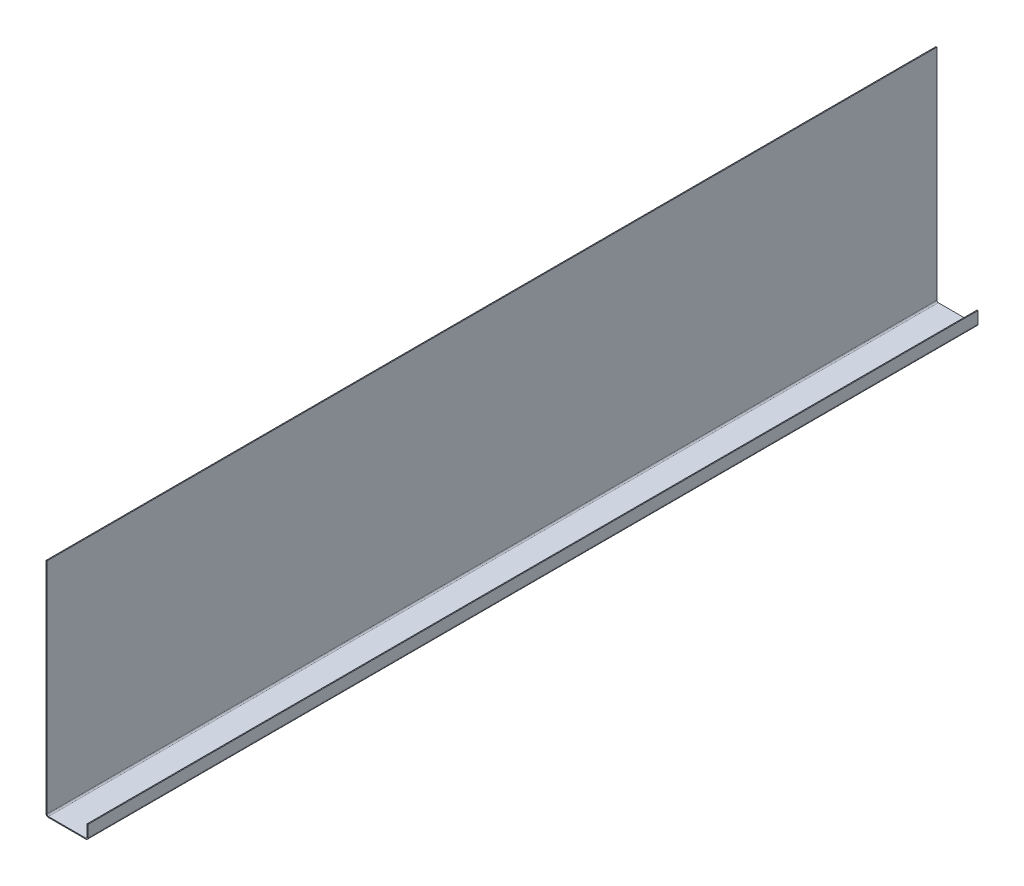
ISO-10303-21;
HEADER;
FILE_DESCRIPTION(('STEP AP214'),'2;1');
FILE_NAME('part.step','',(''),(''),'','','');
FILE_SCHEMA(('AUTOMOTIVE_DESIGN { 1 0 10303 214 1 1 1 1 }'));
ENDSEC;
DATA;
#1=APPLICATION_CONTEXT('core data for automotive mechanical design processes');
#2=APPLICATION_PROTOCOL_DEFINITION('international standard','automotive_design',2000,#1);
#3=PRODUCT_CONTEXT('',#1,'mechanical');
#4=PRODUCT('Part','Part','',(#3));
#5=PRODUCT_RELATED_PRODUCT_CATEGORY('part','',(#4));
#6=PRODUCT_DEFINITION_FORMATION('','',#4);
#7=PRODUCT_DEFINITION_CONTEXT('part definition',#1,'design');
#8=PRODUCT_DEFINITION('design','',#6,#7);
#9=PRODUCT_DEFINITION_SHAPE('','',#8);
#10=(LENGTH_UNIT() NAMED_UNIT(*) SI_UNIT(.MILLI.,.METRE.));
#11=(NAMED_UNIT(*) PLANE_ANGLE_UNIT() SI_UNIT($,.RADIAN.));
#12=(NAMED_UNIT(*) SI_UNIT($,.STERADIAN.) SOLID_ANGLE_UNIT());
#13=UNCERTAINTY_MEASURE_WITH_UNIT(LENGTH_MEASURE(1.E-05),#10,'distance_accuracy_value','');
#14=(GEOMETRIC_REPRESENTATION_CONTEXT(3) GLOBAL_UNCERTAINTY_ASSIGNED_CONTEXT((#13)) GLOBAL_UNIT_ASSIGNED_CONTEXT((#10,
#11,#12)) REPRESENTATION_CONTEXT('',''));
#15=CARTESIAN_POINT('',(0.,0.,0.));
#16=DIRECTION('',(0.,0.,1.));
#17=DIRECTION('',(1.,0.,0.));
#18=AXIS2_PLACEMENT_3D('',#15,#16,#17);
#19=CARTESIAN_POINT('',(0.,3.24999999999998,1205.));
#20=DIRECTION('',(0.,0.,1.));
#21=DIRECTION('',(1.,0.,0.));
#22=AXIS2_PLACEMENT_3D('',#19,#20,#21);
#23=PLANE('',#22);
#24=DIRECTION('',(1.,0.,0.));
#25=VECTOR('',#24,1.);
#26=CARTESIAN_POINT('',(0.,3.24999999999998,1205.));
#27=LINE('',#26,#25);
#28=CARTESIAN_POINT('',(0.,3.24999999999998,1205.));
#29=VERTEX_POINT('',#28);
#30=CARTESIAN_POINT('',(1.25,3.24999999999998,1205.));
#31=VERTEX_POINT('',#30);
#32=EDGE_CURVE('E11',#29,#31,#27,.T.);
#33=ORIENTED_EDGE('',*,*,#32,.F.);
#34=CARTESIAN_POINT('',(3.25,3.24999999999999,1205.));
#35=DIRECTION('',(0.,0.,-1.));
#36=DIRECTION('',(-1.,0.,0.));
#37=AXIS2_PLACEMENT_3D('',#34,#35,#36);
#38=CIRCLE('',#37,3.25);
#39=CARTESIAN_POINT('',(3.25,0.,1205.));
#40=VERTEX_POINT('',#39);
#41=EDGE_CURVE('E146',#29,#40,#38,.F.);
#42=ORIENTED_EDGE('',*,*,#41,.T.);
#43=DIRECTION('',(0.,-1.,0.));
#44=VECTOR('',#43,1.);
#45=CARTESIAN_POINT('',(3.25,1.25,1205.));
#46=LINE('',#45,#44);
#47=CARTESIAN_POINT('',(3.25,1.25,1205.));
#48=VERTEX_POINT('',#47);
#49=EDGE_CURVE('E44',#48,#40,#46,.T.);
#50=ORIENTED_EDGE('',*,*,#49,.F.);
#51=CARTESIAN_POINT('',(3.25,3.24999999999999,1205.));
#52=DIRECTION('',(0.,0.,1.));
#53=DIRECTION('',(1.,0.,0.));
#54=AXIS2_PLACEMENT_3D('',#51,#52,#53);
#55=CIRCLE('',#54,2.);
#56=EDGE_CURVE('E240',#31,#48,#55,.T.);
#57=ORIENTED_EDGE('',*,*,#56,.F.);
#58=EDGE_LOOP('',(#33,#42,#50,#57));
#59=FACE_BOUND('',#58,.T.);
#60=ADVANCED_FACE('F36',(#59),#23,.T.);
#61=CARTESIAN_POINT('',(3.25,1.25,1205.));
#62=DIRECTION('',(0.,0.,1.));
#63=DIRECTION('',(1.,0.,0.));
#64=AXIS2_PLACEMENT_3D('',#61,#62,#63);
#65=PLANE('',#64);
#66=DIRECTION('',(0.,-1.,0.));
#67=VECTOR('',#66,1.);
#68=CARTESIAN_POINT('',(0.,300.,1205.));
#69=LINE('',#68,#67);
#70=CARTESIAN_POINT('',(0.,300.,1205.));
#71=VERTEX_POINT('',#70);
#72=EDGE_CURVE('E151',#71,#29,#69,.T.);
#73=ORIENTED_EDGE('',*,*,#72,.T.);
#74=ORIENTED_EDGE('',*,*,#32,.T.);
#75=DIRECTION('',(0.,1.,0.));
#76=VECTOR('',#75,1.);
#77=CARTESIAN_POINT('',(1.25,300.,1205.));
#78=LINE('',#77,#76);
#79=CARTESIAN_POINT('',(1.25,300.,1205.));
#80=VERTEX_POINT('',#79);
#81=EDGE_CURVE('E253',#80,#31,#78,.F.);
#82=ORIENTED_EDGE('',*,*,#81,.F.);
#83=DIRECTION('',(1.,0.,0.));
#84=VECTOR('',#83,1.);
#85=CARTESIAN_POINT('',(0.,300.,1205.));
#86=LINE('',#85,#84);
#87=EDGE_CURVE('E255',#71,#80,#86,.T.);
#88=ORIENTED_EDGE('',*,*,#87,.F.);
#89=EDGE_LOOP('',(#73,#74,#82,#88));
#90=FACE_BOUND('',#89,.T.);
#91=ADVANCED_FACE('F266',(#90),#65,.T.);
#92=CARTESIAN_POINT('',(3.25,0.,0.));
#93=DIRECTION('',(0.,0.,-1.));
#94=DIRECTION('',(-1.,0.,0.));
#95=AXIS2_PLACEMENT_3D('',#92,#93,#94);
#96=PLANE('',#95);
#97=DIRECTION('',(0.,1.,0.));
#98=VECTOR('',#97,1.);
#99=CARTESIAN_POINT('',(3.25,0.,0.));
#100=LINE('',#99,#98);
#101=CARTESIAN_POINT('',(3.25,0.,0.));
#102=VERTEX_POINT('',#101);
#103=CARTESIAN_POINT('',(3.25,1.25,0.));
#104=VERTEX_POINT('',#103);
#105=EDGE_CURVE('E144',#102,#104,#100,.T.);
#106=ORIENTED_EDGE('',*,*,#105,.F.);
#107=CARTESIAN_POINT('',(3.25,3.24999999999999,0.));
#108=DIRECTION('',(0.,0.,-1.));
#109=DIRECTION('',(-1.,0.,0.));
#110=AXIS2_PLACEMENT_3D('',#107,#108,#109);
#111=CIRCLE('',#110,3.25);
#112=CARTESIAN_POINT('',(0.,3.24999999999998,0.));
#113=VERTEX_POINT('',#112);
#114=EDGE_CURVE('E158',#113,#102,#111,.F.);
#115=ORIENTED_EDGE('',*,*,#114,.F.);
#116=DIRECTION('',(-1.,0.,0.));
#117=VECTOR('',#116,1.);
#118=CARTESIAN_POINT('',(1.25,3.24999999999998,0.));
#119=LINE('',#118,#117);
#120=CARTESIAN_POINT('',(1.25,3.24999999999998,0.));
#121=VERTEX_POINT('',#120);
#122=EDGE_CURVE('E231',#121,#113,#119,.T.);
#123=ORIENTED_EDGE('',*,*,#122,.F.);
#124=CARTESIAN_POINT('',(3.25,3.24999999999999,0.));
#125=DIRECTION('',(0.,0.,1.));
#126=DIRECTION('',(1.,0.,0.));
#127=AXIS2_PLACEMENT_3D('',#124,#125,#126);
#128=CIRCLE('',#127,2.);
#129=EDGE_CURVE('E185',#121,#104,#128,.T.);
#130=ORIENTED_EDGE('',*,*,#129,.T.);
#131=EDGE_LOOP('',(#106,#115,#123,#130));
#132=FACE_BOUND('',#131,.T.);
#133=ADVANCED_FACE('F245',(#132),#96,.T.);
#134=CARTESIAN_POINT('',(1.25,3.24999999999998,0.));
#135=DIRECTION('',(0.,0.,-1.));
#136=DIRECTION('',(-1.,0.,0.));
#137=AXIS2_PLACEMENT_3D('',#134,#135,#136);
#138=PLANE('',#137);
#139=DIRECTION('',(1.,0.,0.));
#140=VECTOR('',#139,1.);
#141=CARTESIAN_POINT('',(0.,0.,0.));
#142=LINE('',#141,#140);
#143=CARTESIAN_POINT('',(53.75,0.,0.));
#144=VERTEX_POINT('',#143);
#145=EDGE_CURVE('E198',#102,#144,#142,.T.);
#146=ORIENTED_EDGE('',*,*,#145,.F.);
#147=ORIENTED_EDGE('',*,*,#105,.T.);
#148=DIRECTION('',(1.,0.,0.));
#149=VECTOR('',#148,1.);
#150=CARTESIAN_POINT('',(0.,1.25,0.));
#151=LINE('',#150,#149);
#152=CARTESIAN_POINT('',(53.75,1.25,0.));
#153=VERTEX_POINT('',#152);
#154=EDGE_CURVE('E183',#104,#153,#151,.T.);
#155=ORIENTED_EDGE('',*,*,#154,.T.);
#156=DIRECTION('',(0.,-1.,0.));
#157=VECTOR('',#156,1.);
#158=CARTESIAN_POINT('',(53.75,1.25,0.));
#159=LINE('',#158,#157);
#160=EDGE_CURVE('E93',#153,#144,#159,.T.);
#161=ORIENTED_EDGE('',*,*,#160,.T.);
#162=EDGE_LOOP('',(#146,#147,#155,#161));
#163=FACE_BOUND('',#162,.T.);
#164=ADVANCED_FACE('F233',(#163),#138,.T.);
#165=CARTESIAN_POINT('',(53.75,0.,1205.));
#166=DIRECTION('',(0.,0.,1.));
#167=DIRECTION('',(1.,0.,0.));
#168=AXIS2_PLACEMENT_3D('',#165,#166,#167);
#169=PLANE('',#168);
#170=DIRECTION('',(0.,1.,0.));
#171=VECTOR('',#170,1.);
#172=CARTESIAN_POINT('',(53.75,0.,1205.));
#173=LINE('',#172,#171);
#174=CARTESIAN_POINT('',(53.75,0.,1205.));
#175=VERTEX_POINT('',#174);
#176=CARTESIAN_POINT('',(53.75,1.25,1205.));
#177=VERTEX_POINT('',#176);
#178=EDGE_CURVE('E229',#175,#177,#173,.T.);
#179=ORIENTED_EDGE('',*,*,#178,.F.);
#180=CARTESIAN_POINT('',(53.75,3.25,1205.));
#181=DIRECTION('',(0.,0.,-1.));
#182=DIRECTION('',(-1.,0.,0.));
#183=AXIS2_PLACEMENT_3D('',#180,#181,#182);
#184=CIRCLE('',#183,3.25);
#185=CARTESIAN_POINT('',(57.,3.25,1205.));
#186=VERTEX_POINT('',#185);
#187=EDGE_CURVE('E166',#175,#186,#184,.F.);
#188=ORIENTED_EDGE('',*,*,#187,.T.);
#189=DIRECTION('',(1.,0.,0.));
#190=VECTOR('',#189,1.);
#191=CARTESIAN_POINT('',(55.75,3.25,1205.));
#192=LINE('',#191,#190);
#193=CARTESIAN_POINT('',(55.75,3.25,1205.));
#194=VERTEX_POINT('',#193);
#195=EDGE_CURVE('E52',#194,#186,#192,.T.);
#196=ORIENTED_EDGE('',*,*,#195,.F.);
#197=CARTESIAN_POINT('',(53.75,3.25,1205.));
#198=DIRECTION('',(0.,0.,1.));
#199=DIRECTION('',(1.,0.,0.));
#200=AXIS2_PLACEMENT_3D('',#197,#198,#199);
#201=CIRCLE('',#200,2.);
#202=EDGE_CURVE('E257',#177,#194,#201,.T.);
#203=ORIENTED_EDGE('',*,*,#202,.F.);
#204=EDGE_LOOP('',(#179,#188,#196,#203));
#205=FACE_BOUND('',#204,.T.);
#206=ADVANCED_FACE('F292',(#205),#169,.T.);
#207=CARTESIAN_POINT('',(55.75,3.25,1205.));
#208=DIRECTION('',(0.,0.,1.));
#209=DIRECTION('',(1.,0.,0.));
#210=AXIS2_PLACEMENT_3D('',#207,#208,#209);
#211=PLANE('',#210);
#212=DIRECTION('',(1.,0.,0.));
#213=VECTOR('',#212,1.);
#214=CARTESIAN_POINT('',(0.,0.,1205.));
#215=LINE('',#214,#213);
#216=EDGE_CURVE('E136',#40,#175,#215,.T.);
#217=ORIENTED_EDGE('',*,*,#216,.T.);
#218=ORIENTED_EDGE('',*,*,#178,.T.);
#219=DIRECTION('',(1.,0.,0.));
#220=VECTOR('',#219,1.);
#221=CARTESIAN_POINT('',(0.,1.25,1205.));
#222=LINE('',#221,#220);
#223=EDGE_CURVE('E139',#48,#177,#222,.T.);
#224=ORIENTED_EDGE('',*,*,#223,.F.);
#225=ORIENTED_EDGE('',*,*,#49,.T.);
#226=EDGE_LOOP('',(#217,#218,#224,#225));
#227=FACE_BOUND('',#226,.T.);
#228=ADVANCED_FACE('F134',(#227),#211,.T.);
#229=CARTESIAN_POINT('',(57.,3.25,0.));
#230=DIRECTION('',(0.,0.,-1.));
#231=DIRECTION('',(-1.,0.,0.));
#232=AXIS2_PLACEMENT_3D('',#229,#230,#231);
#233=PLANE('',#232);
#234=DIRECTION('',(-1.,0.,0.));
#235=VECTOR('',#234,1.);
#236=CARTESIAN_POINT('',(57.,3.25,0.));
#237=LINE('',#236,#235);
#238=CARTESIAN_POINT('',(57.,3.25,0.));
#239=VERTEX_POINT('',#238);
#240=CARTESIAN_POINT('',(55.75,3.25,0.));
#241=VERTEX_POINT('',#240);
#242=EDGE_CURVE('E100',#239,#241,#237,.T.);
#243=ORIENTED_EDGE('',*,*,#242,.F.);
#244=CARTESIAN_POINT('',(53.75,3.25,0.));
#245=DIRECTION('',(0.,0.,-1.));
#246=DIRECTION('',(-1.,0.,0.));
#247=AXIS2_PLACEMENT_3D('',#244,#245,#246);
#248=CIRCLE('',#247,3.25);
#249=EDGE_CURVE('E200',#144,#239,#248,.F.);
#250=ORIENTED_EDGE('',*,*,#249,.F.);
#251=ORIENTED_EDGE('',*,*,#160,.F.);
#252=CARTESIAN_POINT('',(53.75,3.25,0.));
#253=DIRECTION('',(0.,0.,1.));
#254=DIRECTION('',(1.,0.,0.));
#255=AXIS2_PLACEMENT_3D('',#252,#253,#254);
#256=CIRCLE('',#255,2.);
#257=EDGE_CURVE('E181',#153,#241,#256,.T.);
#258=ORIENTED_EDGE('',*,*,#257,.T.);
#259=EDGE_LOOP('',(#243,#250,#251,#258));
#260=FACE_BOUND('',#259,.T.);
#261=ADVANCED_FACE('F298',(#260),#233,.T.);
#262=CARTESIAN_POINT('',(53.75,1.25,0.));
#263=DIRECTION('',(0.,0.,-1.));
#264=DIRECTION('',(-1.,0.,0.));
#265=AXIS2_PLACEMENT_3D('',#262,#263,#264);
#266=PLANE('',#265);
#267=DIRECTION('',(0.,1.,0.));
#268=VECTOR('',#267,1.);
#269=CARTESIAN_POINT('',(57.,0.,0.));
#270=LINE('',#269,#268);
#271=CARTESIAN_POINT('',(57.,19.,0.));
#272=VERTEX_POINT('',#271);
#273=EDGE_CURVE('E172',#239,#272,#270,.T.);
#274=ORIENTED_EDGE('',*,*,#273,.F.);
#275=ORIENTED_EDGE('',*,*,#242,.T.);
#276=DIRECTION('',(0.,1.,0.));
#277=VECTOR('',#276,1.);
#278=CARTESIAN_POINT('',(55.75,0.,0.));
#279=LINE('',#278,#277);
#280=CARTESIAN_POINT('',(55.75,19.,0.));
#281=VERTEX_POINT('',#280);
#282=EDGE_CURVE('E178',#241,#281,#279,.T.);
#283=ORIENTED_EDGE('',*,*,#282,.T.);
#284=DIRECTION('',(1.,0.,0.));
#285=VECTOR('',#284,1.);
#286=CARTESIAN_POINT('',(55.75,19.,0.));
#287=LINE('',#286,#285);
#288=EDGE_CURVE('E175',#281,#272,#287,.T.);
#289=ORIENTED_EDGE('',*,*,#288,.T.);
#290=EDGE_LOOP('',(#274,#275,#283,#289));
#291=FACE_BOUND('',#290,.T.);
#292=ADVANCED_FACE('F301',(#291),#266,.T.);
#293=CARTESIAN_POINT('',(57.,0.,1205.));
#294=DIRECTION('',(-1.,0.,0.));
#295=DIRECTION('',(0.,0.,1.));
#296=AXIS2_PLACEMENT_3D('',#293,#294,#295);
#297=PLANE('',#296);
#298=ORIENTED_EDGE('',*,*,#273,.T.);
#299=DIRECTION('',(0.,0.,-1.));
#300=VECTOR('',#299,1.);
#301=CARTESIAN_POINT('',(57.,19.,1205.));
#302=LINE('',#301,#300);
#303=CARTESIAN_POINT('',(57.,19.,1205.));
#304=VERTEX_POINT('',#303);
#305=EDGE_CURVE('E224',#304,#272,#302,.T.);
#306=ORIENTED_EDGE('',*,*,#305,.F.);
#307=DIRECTION('',(0.,1.,0.));
#308=VECTOR('',#307,1.);
#309=CARTESIAN_POINT('',(57.,0.,1205.));
#310=LINE('',#309,#308);
#311=EDGE_CURVE('E106',#186,#304,#310,.T.);
#312=ORIENTED_EDGE('',*,*,#311,.F.);
#313=DIRECTION('',(0.,0.,-1.));
#314=VECTOR('',#313,1.);
#315=CARTESIAN_POINT('',(57.,3.25,1205.));
#316=LINE('',#315,#314);
#317=EDGE_CURVE('E168',#186,#239,#316,.T.);
#318=ORIENTED_EDGE('',*,*,#317,.T.);
#319=EDGE_LOOP('',(#298,#306,#312,#318));
#320=FACE_BOUND('',#319,.T.);
#321=ADVANCED_FACE('F304',(#320),#297,.F.);
#322=CARTESIAN_POINT('',(55.75,19.,1205.));
#323=DIRECTION('',(0.,1.,0.));
#324=DIRECTION('',(0.,0.,1.));
#325=AXIS2_PLACEMENT_3D('',#322,#323,#324);
#326=PLANE('',#325);
#327=ORIENTED_EDGE('',*,*,#288,.F.);
#328=DIRECTION('',(0.,0.,-1.));
#329=VECTOR('',#328,1.);
#330=CARTESIAN_POINT('',(55.75,19.,1205.));
#331=LINE('',#330,#329);
#332=CARTESIAN_POINT('',(55.75,19.,1205.));
#333=VERTEX_POINT('',#332);
#334=EDGE_CURVE('E222',#333,#281,#331,.T.);
#335=ORIENTED_EDGE('',*,*,#334,.F.);
#336=DIRECTION('',(1.,0.,0.));
#337=VECTOR('',#336,1.);
#338=CARTESIAN_POINT('',(55.75,19.,1205.));
#339=LINE('',#338,#337);
#340=EDGE_CURVE('E512',#333,#304,#339,.T.);
#341=ORIENTED_EDGE('',*,*,#340,.T.);
#342=ORIENTED_EDGE('',*,*,#305,.T.);
#343=EDGE_LOOP('',(#327,#335,#341,#342));
#344=FACE_BOUND('',#343,.T.);
#345=ADVANCED_FACE('F308',(#344),#326,.T.);
#346=CARTESIAN_POINT('',(55.75,0.,1205.));
#347=DIRECTION('',(-1.,0.,0.));
#348=DIRECTION('',(0.,0.,1.));
#349=AXIS2_PLACEMENT_3D('',#346,#347,#348);
#350=PLANE('',#349);
#351=ORIENTED_EDGE('',*,*,#282,.F.);
#352=DIRECTION('',(0.,0.,-1.));
#353=VECTOR('',#352,1.);
#354=CARTESIAN_POINT('',(55.75,3.25,1205.));
#355=LINE('',#354,#353);
#356=EDGE_CURVE('E219',#194,#241,#355,.T.);
#357=ORIENTED_EDGE('',*,*,#356,.F.);
#358=DIRECTION('',(0.,1.,0.));
#359=VECTOR('',#358,1.);
#360=CARTESIAN_POINT('',(55.75,0.,1205.));
#361=LINE('',#360,#359);
#362=EDGE_CURVE('E514',#194,#333,#361,.T.);
#363=ORIENTED_EDGE('',*,*,#362,.T.);
#364=ORIENTED_EDGE('',*,*,#334,.T.);
#365=EDGE_LOOP('',(#351,#357,#363,#364));
#366=FACE_BOUND('',#365,.T.);
#367=ADVANCED_FACE('F312',(#366),#350,.T.);
#368=CARTESIAN_POINT('',(53.75,3.25,1205.));
#369=DIRECTION('',(0.,0.,-1.));
#370=DIRECTION('',(-1.,0.,0.));
#371=AXIS2_PLACEMENT_3D('',#368,#369,#370);
#372=CYLINDRICAL_SURFACE('',#371,2.);
#373=ORIENTED_EDGE('',*,*,#257,.F.);
#374=DIRECTION('',(0.,0.,-1.));
#375=VECTOR('',#374,1.);
#376=CARTESIAN_POINT('',(53.75,1.25,1205.));
#377=LINE('',#376,#375);
#378=EDGE_CURVE('E216',#177,#153,#377,.T.);
#379=ORIENTED_EDGE('',*,*,#378,.F.);
#380=ORIENTED_EDGE('',*,*,#202,.T.);
#381=ORIENTED_EDGE('',*,*,#356,.T.);
#382=EDGE_LOOP('',(#373,#379,#380,#381));
#383=FACE_BOUND('',#382,.T.);
#384=ADVANCED_FACE('F316',(#383),#372,.F.);
#385=CARTESIAN_POINT('',(0.,1.25,1205.));
#386=DIRECTION('',(0.,1.,0.));
#387=DIRECTION('',(0.,0.,1.));
#388=AXIS2_PLACEMENT_3D('',#385,#386,#387);
#389=PLANE('',#388);
#390=ORIENTED_EDGE('',*,*,#154,.F.);
#391=DIRECTION('',(0.,0.,-1.));
#392=VECTOR('',#391,1.);
#393=CARTESIAN_POINT('',(3.25,1.25,1205.));
#394=LINE('',#393,#392);
#395=EDGE_CURVE('E213',#48,#104,#394,.T.);
#396=ORIENTED_EDGE('',*,*,#395,.F.);
#397=ORIENTED_EDGE('',*,*,#223,.T.);
#398=ORIENTED_EDGE('',*,*,#378,.T.);
#399=EDGE_LOOP('',(#390,#396,#397,#398));
#400=FACE_BOUND('',#399,.T.);
#401=ADVANCED_FACE('F242',(#400),#389,.T.);
#402=CARTESIAN_POINT('',(3.25,3.24999999999999,1205.));
#403=DIRECTION('',(0.,0.,-1.));
#404=DIRECTION('',(-1.,0.,0.));
#405=AXIS2_PLACEMENT_3D('',#402,#403,#404);
#406=CYLINDRICAL_SURFACE('',#405,2.);
#407=ORIENTED_EDGE('',*,*,#129,.F.);
#408=DIRECTION('',(0.,0.,-1.));
#409=VECTOR('',#408,1.);
#410=CARTESIAN_POINT('',(1.25,3.24999999999998,1205.));
#411=LINE('',#410,#409);
#412=EDGE_CURVE('E210',#31,#121,#411,.T.);
#413=ORIENTED_EDGE('',*,*,#412,.F.);
#414=ORIENTED_EDGE('',*,*,#56,.T.);
#415=ORIENTED_EDGE('',*,*,#395,.T.);
#416=EDGE_LOOP('',(#407,#413,#414,#415));
#417=FACE_BOUND('',#416,.T.);
#418=ADVANCED_FACE('F238',(#417),#406,.F.);
#419=CARTESIAN_POINT('',(1.25,300.,1205.));
#420=DIRECTION('',(1.,0.,0.));
#421=DIRECTION('',(0.,0.,-1.));
#422=AXIS2_PLACEMENT_3D('',#419,#420,#421);
#423=PLANE('',#422);
#424=DIRECTION('',(0.,1.,0.));
#425=VECTOR('',#424,1.);
#426=CARTESIAN_POINT('',(1.25,300.,0.));
#427=LINE('',#426,#425);
#428=CARTESIAN_POINT('',(1.25,300.,0.));
#429=VERTEX_POINT('',#428);
#430=EDGE_CURVE('E188',#429,#121,#427,.F.);
#431=ORIENTED_EDGE('',*,*,#430,.F.);
#432=DIRECTION('',(0.,0.,-1.));
#433=VECTOR('',#432,1.);
#434=CARTESIAN_POINT('',(1.25,300.,1205.));
#435=LINE('',#434,#433);
#436=EDGE_CURVE('E208',#80,#429,#435,.T.);
#437=ORIENTED_EDGE('',*,*,#436,.F.);
#438=ORIENTED_EDGE('',*,*,#81,.T.);
#439=ORIENTED_EDGE('',*,*,#412,.T.);
#440=EDGE_LOOP('',(#431,#437,#438,#439));
#441=FACE_BOUND('',#440,.T.);
#442=ADVANCED_FACE('F251',(#441),#423,.T.);
#443=CARTESIAN_POINT('',(0.,300.,1205.));
#444=DIRECTION('',(0.,1.,0.));
#445=DIRECTION('',(0.,0.,1.));
#446=AXIS2_PLACEMENT_3D('',#443,#444,#445);
#447=PLANE('',#446);
#448=DIRECTION('',(1.,0.,0.));
#449=VECTOR('',#448,1.);
#450=CARTESIAN_POINT('',(0.,300.,0.));
#451=LINE('',#450,#449);
#452=CARTESIAN_POINT('',(0.,300.,0.));
#453=VERTEX_POINT('',#452);
#454=EDGE_CURVE('E191',#453,#429,#451,.T.);
#455=ORIENTED_EDGE('',*,*,#454,.F.);
#456=DIRECTION('',(0.,0.,-1.));
#457=VECTOR('',#456,1.);
#458=CARTESIAN_POINT('',(0.,300.,1205.));
#459=LINE('',#458,#457);
#460=EDGE_CURVE('E206',#71,#453,#459,.T.);
#461=ORIENTED_EDGE('',*,*,#460,.F.);
#462=ORIENTED_EDGE('',*,*,#87,.T.);
#463=ORIENTED_EDGE('',*,*,#436,.T.);
#464=EDGE_LOOP('',(#455,#461,#462,#463));
#465=FACE_BOUND('',#464,.T.);
#466=ADVANCED_FACE('F272',(#465),#447,.T.);
#467=CARTESIAN_POINT('',(0.,300.,1205.));
#468=DIRECTION('',(1.,0.,0.));
#469=DIRECTION('',(0.,0.,-1.));
#470=AXIS2_PLACEMENT_3D('',#467,#468,#469);
#471=PLANE('',#470);
#472=DIRECTION('',(0.,-1.,0.));
#473=VECTOR('',#472,1.);
#474=CARTESIAN_POINT('',(0.,300.,0.));
#475=LINE('',#474,#473);
#476=EDGE_CURVE('E194',#453,#113,#475,.T.);
#477=ORIENTED_EDGE('',*,*,#476,.T.);
#478=DIRECTION('',(0.,0.,-1.));
#479=VECTOR('',#478,1.);
#480=CARTESIAN_POINT('',(0.,3.24999999999998,1205.));
#481=LINE('',#480,#479);
#482=EDGE_CURVE('E160',#29,#113,#481,.T.);
#483=ORIENTED_EDGE('',*,*,#482,.F.);
#484=ORIENTED_EDGE('',*,*,#72,.F.);
#485=ORIENTED_EDGE('',*,*,#460,.T.);
#486=EDGE_LOOP('',(#477,#483,#484,#485));
#487=FACE_BOUND('',#486,.T.);
#488=ADVANCED_FACE('F268',(#487),#471,.F.);
#489=CARTESIAN_POINT('',(3.25,3.24999999999999,1205.));
#490=DIRECTION('',(0.,0.,-1.));
#491=DIRECTION('',(-1.,0.,0.));
#492=AXIS2_PLACEMENT_3D('',#489,#490,#491);
#493=CYLINDRICAL_SURFACE('',#492,3.25);
#494=ORIENTED_EDGE('',*,*,#114,.T.);
#495=DIRECTION('',(0.,0.,-1.));
#496=VECTOR('',#495,1.);
#497=CARTESIAN_POINT('',(3.25,0.,1205.));
#498=LINE('',#497,#496);
#499=EDGE_CURVE('E155',#40,#102,#498,.T.);
#500=ORIENTED_EDGE('',*,*,#499,.F.);
#501=ORIENTED_EDGE('',*,*,#41,.F.);
#502=ORIENTED_EDGE('',*,*,#482,.T.);
#503=EDGE_LOOP('',(#494,#500,#501,#502));
#504=FACE_BOUND('',#503,.T.);
#505=ADVANCED_FACE('F156',(#504),#493,.T.);
#506=CARTESIAN_POINT('',(0.,0.,1205.));
#507=DIRECTION('',(0.,1.,0.));
#508=DIRECTION('',(0.,0.,1.));
#509=AXIS2_PLACEMENT_3D('',#506,#507,#508);
#510=PLANE('',#509);
#511=ORIENTED_EDGE('',*,*,#145,.T.);
#512=DIRECTION('',(0.,0.,-1.));
#513=VECTOR('',#512,1.);
#514=CARTESIAN_POINT('',(53.75,0.,1205.));
#515=LINE('',#514,#513);
#516=EDGE_CURVE('E161',#175,#144,#515,.T.);
#517=ORIENTED_EDGE('',*,*,#516,.F.);
#518=ORIENTED_EDGE('',*,*,#216,.F.);
#519=ORIENTED_EDGE('',*,*,#499,.T.);
#520=EDGE_LOOP('',(#511,#517,#518,#519));
#521=FACE_BOUND('',#520,.T.);
#522=ADVANCED_FACE('F163',(#521),#510,.F.);
#523=CARTESIAN_POINT('',(53.75,3.25,1205.));
#524=DIRECTION('',(0.,0.,-1.));
#525=DIRECTION('',(-1.,0.,0.));
#526=AXIS2_PLACEMENT_3D('',#523,#524,#525);
#527=CYLINDRICAL_SURFACE('',#526,3.25);
#528=ORIENTED_EDGE('',*,*,#249,.T.);
#529=ORIENTED_EDGE('',*,*,#317,.F.);
#530=ORIENTED_EDGE('',*,*,#187,.F.);
#531=ORIENTED_EDGE('',*,*,#516,.T.);
#532=EDGE_LOOP('',(#528,#529,#530,#531));
#533=FACE_BOUND('',#532,.T.);
#534=ADVANCED_FACE('F363',(#533),#527,.T.);
#535=CARTESIAN_POINT('',(53.75,3.25,1205.));
#536=DIRECTION('',(0.,0.,1.));
#537=DIRECTION('',(1.,0.,0.));
#538=AXIS2_PLACEMENT_3D('',#535,#536,#537);
#539=PLANE('',#538);
#540=ORIENTED_EDGE('',*,*,#311,.T.);
#541=ORIENTED_EDGE('',*,*,#340,.F.);
#542=ORIENTED_EDGE('',*,*,#362,.F.);
#543=ORIENTED_EDGE('',*,*,#195,.T.);
#544=EDGE_LOOP('',(#540,#541,#542,#543));
#545=FACE_BOUND('',#544,.T.);
#546=ADVANCED_FACE('F373',(#545),#539,.T.);
#547=CARTESIAN_POINT('',(53.75,3.25,0.));
#548=DIRECTION('',(0.,0.,1.));
#549=DIRECTION('',(1.,0.,0.));
#550=AXIS2_PLACEMENT_3D('',#547,#548,#549);
#551=PLANE('',#550);
#552=ORIENTED_EDGE('',*,*,#430,.T.);
#553=ORIENTED_EDGE('',*,*,#122,.T.);
#554=ORIENTED_EDGE('',*,*,#476,.F.);
#555=ORIENTED_EDGE('',*,*,#454,.T.);
#556=EDGE_LOOP('',(#552,#553,#554,#555));
#557=FACE_BOUND('',#556,.T.);
#558=ADVANCED_FACE('F270',(#557),#551,.F.);
#559=CLOSED_SHELL('',(#60,#91,#133,#164,#206,#228,#261,#292,#321,#345,#367,#384,#401,#418,#442,
#466,#488,#505,#522,#534,#546,#558));
#560=MANIFOLD_SOLID_BREP('B2',#559);
#561=ADVANCED_BREP_SHAPE_REPRESENTATION('',(#18,#560),#14);
#562=SHAPE_DEFINITION_REPRESENTATION(#9,#561);
ENDSEC;
END-ISO-10303-21;
